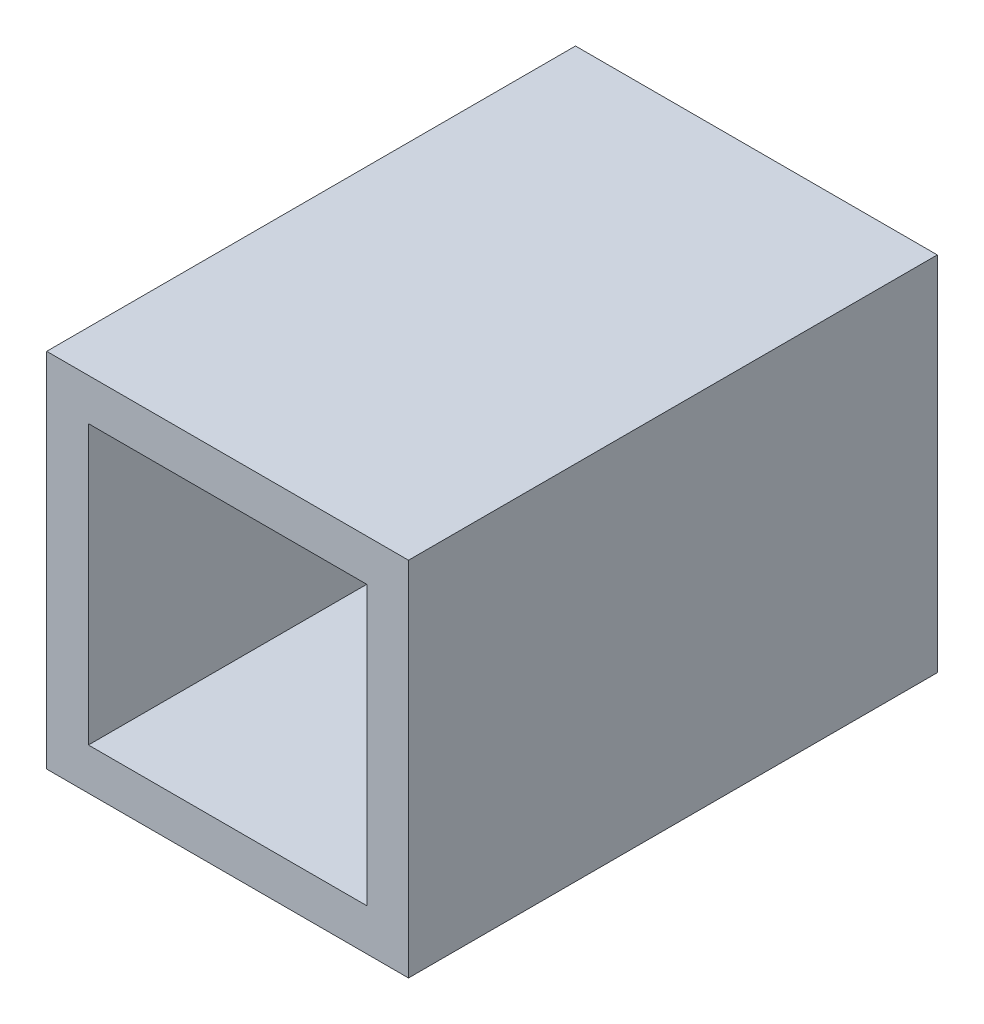
ISO-10303-21;
HEADER;
FILE_DESCRIPTION(('STEP AP214'),'2;1');
FILE_NAME('part.step','',(''),(''),'','','');
FILE_SCHEMA(('AUTOMOTIVE_DESIGN { 1 0 10303 214 1 1 1 1 }'));
ENDSEC;
DATA;
#1=APPLICATION_CONTEXT('core data for automotive mechanical design processes');
#2=APPLICATION_PROTOCOL_DEFINITION('international standard','automotive_design',2000,#1);
#3=PRODUCT_CONTEXT('',#1,'mechanical');
#4=PRODUCT('Part','Part','',(#3));
#5=PRODUCT_RELATED_PRODUCT_CATEGORY('part','',(#4));
#6=PRODUCT_DEFINITION_FORMATION('','',#4);
#7=PRODUCT_DEFINITION_CONTEXT('part definition',#1,'design');
#8=PRODUCT_DEFINITION('design','',#6,#7);
#9=PRODUCT_DEFINITION_SHAPE('','',#8);
#10=(LENGTH_UNIT() NAMED_UNIT(*) SI_UNIT(.MILLI.,.METRE.));
#11=(NAMED_UNIT(*) PLANE_ANGLE_UNIT() SI_UNIT($,.RADIAN.));
#12=(NAMED_UNIT(*) SI_UNIT($,.STERADIAN.) SOLID_ANGLE_UNIT());
#13=UNCERTAINTY_MEASURE_WITH_UNIT(LENGTH_MEASURE(1.E-05),#10,'distance_accuracy_value','');
#14=(GEOMETRIC_REPRESENTATION_CONTEXT(3) GLOBAL_UNCERTAINTY_ASSIGNED_CONTEXT((#13)) GLOBAL_UNIT_ASSIGNED_CONTEXT((#10,
#11,#12)) REPRESENTATION_CONTEXT('',''));
#15=CARTESIAN_POINT('',(0.,0.,0.));
#16=DIRECTION('',(0.,0.,1.));
#17=DIRECTION('',(1.,0.,0.));
#18=AXIS2_PLACEMENT_3D('',#15,#16,#17);
#19=CARTESIAN_POINT('',(0.,0.,19.));
#20=DIRECTION('',(0.,0.,1.));
#21=DIRECTION('',(1.,0.,0.));
#22=AXIS2_PLACEMENT_3D('',#19,#20,#21);
#23=PLANE('',#22);
#24=DIRECTION('',(0.,1.,0.));
#25=VECTOR('',#24,1.);
#26=CARTESIAN_POINT('',(6.5,6.5,19.));
#27=LINE('',#26,#25);
#28=CARTESIAN_POINT('',(6.5,-6.5,19.));
#29=VERTEX_POINT('',#28);
#30=CARTESIAN_POINT('',(6.5,6.5,19.));
#31=VERTEX_POINT('',#30);
#32=EDGE_CURVE('E136',#29,#31,#27,.T.);
#33=ORIENTED_EDGE('',*,*,#32,.T.);
#34=DIRECTION('',(-1.,0.,0.));
#35=VECTOR('',#34,1.);
#36=CARTESIAN_POINT('',(-6.5,6.5,19.));
#37=LINE('',#36,#35);
#38=CARTESIAN_POINT('',(-6.5,6.5,19.));
#39=VERTEX_POINT('',#38);
#40=EDGE_CURVE('E139',#31,#39,#37,.T.);
#41=ORIENTED_EDGE('',*,*,#40,.T.);
#42=DIRECTION('',(0.,-1.,0.));
#43=VECTOR('',#42,1.);
#44=CARTESIAN_POINT('',(-6.5,6.5,19.));
#45=LINE('',#44,#43);
#46=CARTESIAN_POINT('',(-6.5,-6.5,19.));
#47=VERTEX_POINT('',#46);
#48=EDGE_CURVE('E142',#39,#47,#45,.T.);
#49=ORIENTED_EDGE('',*,*,#48,.T.);
#50=DIRECTION('',(1.,0.,0.));
#51=VECTOR('',#50,1.);
#52=CARTESIAN_POINT('',(-6.5,-6.5,19.));
#53=LINE('',#52,#51);
#54=EDGE_CURVE('E144',#47,#29,#53,.T.);
#55=ORIENTED_EDGE('',*,*,#54,.T.);
#56=EDGE_LOOP('',(#33,#41,#49,#55));
#57=FACE_BOUND('',#56,.T.);
#58=DIRECTION('',(-1.,0.,0.));
#59=VECTOR('',#58,1.);
#60=CARTESIAN_POINT('',(-5.,5.00000000000001,19.));
#61=LINE('',#60,#59);
#62=CARTESIAN_POINT('',(5.,5.00000000000001,19.));
#63=VERTEX_POINT('',#62);
#64=CARTESIAN_POINT('',(-5.,5.00000000000001,19.));
#65=VERTEX_POINT('',#64);
#66=EDGE_CURVE('E108',#63,#65,#61,.T.);
#67=ORIENTED_EDGE('',*,*,#66,.F.);
#68=DIRECTION('',(0.,1.,0.));
#69=VECTOR('',#68,1.);
#70=CARTESIAN_POINT('',(5.,-5.,19.));
#71=LINE('',#70,#69);
#72=CARTESIAN_POINT('',(5.,-5.,19.));
#73=VERTEX_POINT('',#72);
#74=EDGE_CURVE('E100',#73,#63,#71,.T.);
#75=ORIENTED_EDGE('',*,*,#74,.F.);
#76=DIRECTION('',(1.,0.,0.));
#77=VECTOR('',#76,1.);
#78=CARTESIAN_POINT('',(-5.,-5.,19.));
#79=LINE('',#78,#77);
#80=CARTESIAN_POINT('',(-5.,-5.,19.));
#81=VERTEX_POINT('',#80);
#82=EDGE_CURVE('E122',#81,#73,#79,.T.);
#83=ORIENTED_EDGE('',*,*,#82,.F.);
#84=DIRECTION('',(0.,-1.,0.));
#85=VECTOR('',#84,1.);
#86=CARTESIAN_POINT('',(-5.,-5.,19.));
#87=LINE('',#86,#85);
#88=EDGE_CURVE('E120',#65,#81,#87,.T.);
#89=ORIENTED_EDGE('',*,*,#88,.F.);
#90=EDGE_LOOP('',(#67,#75,#83,#89));
#91=FACE_BOUND('',#90,.T.);
#92=ADVANCED_FACE('F35',(#57,#91),#23,.T.);
#93=CARTESIAN_POINT('',(0.,0.,0.));
#94=DIRECTION('',(0.,0.,1.));
#95=DIRECTION('',(1.,0.,0.));
#96=AXIS2_PLACEMENT_3D('',#93,#94,#95);
#97=PLANE('',#96);
#98=DIRECTION('',(0.,1.,0.));
#99=VECTOR('',#98,1.);
#100=CARTESIAN_POINT('',(6.5,6.5,0.));
#101=LINE('',#100,#99);
#102=CARTESIAN_POINT('',(6.5,-6.5,0.));
#103=VERTEX_POINT('',#102);
#104=CARTESIAN_POINT('',(6.5,6.5,0.));
#105=VERTEX_POINT('',#104);
#106=EDGE_CURVE('E116',#103,#105,#101,.T.);
#107=ORIENTED_EDGE('',*,*,#106,.F.);
#108=DIRECTION('',(1.,0.,0.));
#109=VECTOR('',#108,1.);
#110=CARTESIAN_POINT('',(-6.5,-6.5,0.));
#111=LINE('',#110,#109);
#112=CARTESIAN_POINT('',(-6.5,-6.5,0.));
#113=VERTEX_POINT('',#112);
#114=EDGE_CURVE('E140',#113,#103,#111,.T.);
#115=ORIENTED_EDGE('',*,*,#114,.F.);
#116=DIRECTION('',(0.,-1.,0.));
#117=VECTOR('',#116,1.);
#118=CARTESIAN_POINT('',(-6.5,6.5,0.));
#119=LINE('',#118,#117);
#120=CARTESIAN_POINT('',(-6.5,6.5,0.));
#121=VERTEX_POINT('',#120);
#122=EDGE_CURVE('E151',#121,#113,#119,.T.);
#123=ORIENTED_EDGE('',*,*,#122,.F.);
#124=DIRECTION('',(-1.,0.,0.));
#125=VECTOR('',#124,1.);
#126=CARTESIAN_POINT('',(-6.5,6.5,0.));
#127=LINE('',#126,#125);
#128=EDGE_CURVE('E149',#105,#121,#127,.T.);
#129=ORIENTED_EDGE('',*,*,#128,.F.);
#130=EDGE_LOOP('',(#107,#115,#123,#129));
#131=FACE_BOUND('',#130,.T.);
#132=DIRECTION('',(0.,1.,0.));
#133=VECTOR('',#132,1.);
#134=CARTESIAN_POINT('',(5.,-5.,0.));
#135=LINE('',#134,#133);
#136=CARTESIAN_POINT('',(5.,-5.,0.));
#137=VERTEX_POINT('',#136);
#138=CARTESIAN_POINT('',(5.,5.00000000000001,0.));
#139=VERTEX_POINT('',#138);
#140=EDGE_CURVE('E58',#137,#139,#135,.T.);
#141=ORIENTED_EDGE('',*,*,#140,.T.);
#142=DIRECTION('',(-1.,0.,0.));
#143=VECTOR('',#142,1.);
#144=CARTESIAN_POINT('',(-5.,5.00000000000001,0.));
#145=LINE('',#144,#143);
#146=CARTESIAN_POINT('',(-5.,5.00000000000001,0.));
#147=VERTEX_POINT('',#146);
#148=EDGE_CURVE('E115',#139,#147,#145,.T.);
#149=ORIENTED_EDGE('',*,*,#148,.T.);
#150=DIRECTION('',(0.,-1.,0.));
#151=VECTOR('',#150,1.);
#152=CARTESIAN_POINT('',(-5.,-5.,0.));
#153=LINE('',#152,#151);
#154=CARTESIAN_POINT('',(-5.,-5.,0.));
#155=VERTEX_POINT('',#154);
#156=EDGE_CURVE('E128',#147,#155,#153,.T.);
#157=ORIENTED_EDGE('',*,*,#156,.T.);
#158=DIRECTION('',(1.,0.,0.));
#159=VECTOR('',#158,1.);
#160=CARTESIAN_POINT('',(-5.,-5.,0.));
#161=LINE('',#160,#159);
#162=EDGE_CURVE('E109',#155,#137,#161,.T.);
#163=ORIENTED_EDGE('',*,*,#162,.T.);
#164=EDGE_LOOP('',(#141,#149,#157,#163));
#165=FACE_BOUND('',#164,.T.);
#166=ADVANCED_FACE('F169',(#131,#165),#97,.F.);
#167=CARTESIAN_POINT('',(6.5,6.5,19.));
#168=DIRECTION('',(-1.,0.,0.));
#169=DIRECTION('',(0.,0.,1.));
#170=AXIS2_PLACEMENT_3D('',#167,#168,#169);
#171=PLANE('',#170);
#172=ORIENTED_EDGE('',*,*,#106,.T.);
#173=DIRECTION('',(0.,0.,-1.));
#174=VECTOR('',#173,1.);
#175=CARTESIAN_POINT('',(6.5,6.5,19.));
#176=LINE('',#175,#174);
#177=EDGE_CURVE('E11',#31,#105,#176,.T.);
#178=ORIENTED_EDGE('',*,*,#177,.F.);
#179=ORIENTED_EDGE('',*,*,#32,.F.);
#180=DIRECTION('',(0.,0.,-1.));
#181=VECTOR('',#180,1.);
#182=CARTESIAN_POINT('',(6.5,-6.5,19.));
#183=LINE('',#182,#181);
#184=EDGE_CURVE('E146',#29,#103,#183,.T.);
#185=ORIENTED_EDGE('',*,*,#184,.T.);
#186=EDGE_LOOP('',(#172,#178,#179,#185));
#187=FACE_BOUND('',#186,.T.);
#188=ADVANCED_FACE('F37',(#187),#171,.F.);
#189=CARTESIAN_POINT('',(-6.5,6.5,19.));
#190=DIRECTION('',(0.,-1.,0.));
#191=DIRECTION('',(0.,0.,-1.));
#192=AXIS2_PLACEMENT_3D('',#189,#190,#191);
#193=PLANE('',#192);
#194=ORIENTED_EDGE('',*,*,#128,.T.);
#195=DIRECTION('',(0.,0.,-1.));
#196=VECTOR('',#195,1.);
#197=CARTESIAN_POINT('',(-6.5,6.5,19.));
#198=LINE('',#197,#196);
#199=EDGE_CURVE('E43',#39,#121,#198,.T.);
#200=ORIENTED_EDGE('',*,*,#199,.F.);
#201=ORIENTED_EDGE('',*,*,#40,.F.);
#202=ORIENTED_EDGE('',*,*,#177,.T.);
#203=EDGE_LOOP('',(#194,#200,#201,#202));
#204=FACE_BOUND('',#203,.T.);
#205=ADVANCED_FACE('F179',(#204),#193,.F.);
#206=CARTESIAN_POINT('',(-6.5,6.5,19.));
#207=DIRECTION('',(1.,0.,0.));
#208=DIRECTION('',(0.,0.,-1.));
#209=AXIS2_PLACEMENT_3D('',#206,#207,#208);
#210=PLANE('',#209);
#211=ORIENTED_EDGE('',*,*,#122,.T.);
#212=DIRECTION('',(0.,0.,-1.));
#213=VECTOR('',#212,1.);
#214=CARTESIAN_POINT('',(-6.5,-6.5,19.));
#215=LINE('',#214,#213);
#216=EDGE_CURVE('E156',#47,#113,#215,.T.);
#217=ORIENTED_EDGE('',*,*,#216,.F.);
#218=ORIENTED_EDGE('',*,*,#48,.F.);
#219=ORIENTED_EDGE('',*,*,#199,.T.);
#220=EDGE_LOOP('',(#211,#217,#218,#219));
#221=FACE_BOUND('',#220,.T.);
#222=ADVANCED_FACE('F163',(#221),#210,.F.);
#223=CARTESIAN_POINT('',(-6.5,-6.5,19.));
#224=DIRECTION('',(0.,1.,0.));
#225=DIRECTION('',(0.,0.,1.));
#226=AXIS2_PLACEMENT_3D('',#223,#224,#225);
#227=PLANE('',#226);
#228=ORIENTED_EDGE('',*,*,#114,.T.);
#229=ORIENTED_EDGE('',*,*,#184,.F.);
#230=ORIENTED_EDGE('',*,*,#54,.F.);
#231=ORIENTED_EDGE('',*,*,#216,.T.);
#232=EDGE_LOOP('',(#228,#229,#230,#231));
#233=FACE_BOUND('',#232,.T.);
#234=ADVANCED_FACE('F173',(#233),#227,.F.);
#235=CARTESIAN_POINT('',(5.,-5.,19.));
#236=DIRECTION('',(-1.,0.,0.));
#237=DIRECTION('',(0.,0.,1.));
#238=AXIS2_PLACEMENT_3D('',#235,#236,#237);
#239=PLANE('',#238);
#240=ORIENTED_EDGE('',*,*,#140,.F.);
#241=DIRECTION('',(0.,0.,-1.));
#242=VECTOR('',#241,1.);
#243=CARTESIAN_POINT('',(5.,-5.,19.));
#244=LINE('',#243,#242);
#245=EDGE_CURVE('E104',#73,#137,#244,.T.);
#246=ORIENTED_EDGE('',*,*,#245,.F.);
#247=ORIENTED_EDGE('',*,*,#74,.T.);
#248=DIRECTION('',(0.,0.,-1.));
#249=VECTOR('',#248,1.);
#250=CARTESIAN_POINT('',(5.,5.00000000000001,19.));
#251=LINE('',#250,#249);
#252=EDGE_CURVE('E103',#63,#139,#251,.T.);
#253=ORIENTED_EDGE('',*,*,#252,.T.);
#254=EDGE_LOOP('',(#240,#246,#247,#253));
#255=FACE_BOUND('',#254,.T.);
#256=ADVANCED_FACE('F102',(#255),#239,.T.);
#257=CARTESIAN_POINT('',(-5.,5.00000000000001,19.));
#258=DIRECTION('',(0.,-1.,0.));
#259=DIRECTION('',(0.,0.,-1.));
#260=AXIS2_PLACEMENT_3D('',#257,#258,#259);
#261=PLANE('',#260);
#262=ORIENTED_EDGE('',*,*,#148,.F.);
#263=ORIENTED_EDGE('',*,*,#252,.F.);
#264=ORIENTED_EDGE('',*,*,#66,.T.);
#265=DIRECTION('',(0.,0.,-1.));
#266=VECTOR('',#265,1.);
#267=CARTESIAN_POINT('',(-5.,5.00000000000001,19.));
#268=LINE('',#267,#266);
#269=EDGE_CURVE('E117',#65,#147,#268,.T.);
#270=ORIENTED_EDGE('',*,*,#269,.T.);
#271=EDGE_LOOP('',(#262,#263,#264,#270));
#272=FACE_BOUND('',#271,.T.);
#273=ADVANCED_FACE('F112',(#272),#261,.T.);
#274=CARTESIAN_POINT('',(-5.,-5.,19.));
#275=DIRECTION('',(1.,0.,0.));
#276=DIRECTION('',(0.,0.,-1.));
#277=AXIS2_PLACEMENT_3D('',#274,#275,#276);
#278=PLANE('',#277);
#279=ORIENTED_EDGE('',*,*,#156,.F.);
#280=ORIENTED_EDGE('',*,*,#269,.F.);
#281=ORIENTED_EDGE('',*,*,#88,.T.);
#282=DIRECTION('',(0.,0.,-1.));
#283=VECTOR('',#282,1.);
#284=CARTESIAN_POINT('',(-5.,-5.,19.));
#285=LINE('',#284,#283);
#286=EDGE_CURVE('E50',#81,#155,#285,.T.);
#287=ORIENTED_EDGE('',*,*,#286,.T.);
#288=EDGE_LOOP('',(#279,#280,#281,#287));
#289=FACE_BOUND('',#288,.T.);
#290=ADVANCED_FACE('F202',(#289),#278,.T.);
#291=CARTESIAN_POINT('',(-5.,-5.,19.));
#292=DIRECTION('',(0.,1.,0.));
#293=DIRECTION('',(0.,0.,1.));
#294=AXIS2_PLACEMENT_3D('',#291,#292,#293);
#295=PLANE('',#294);
#296=ORIENTED_EDGE('',*,*,#162,.F.);
#297=ORIENTED_EDGE('',*,*,#286,.F.);
#298=ORIENTED_EDGE('',*,*,#82,.T.);
#299=ORIENTED_EDGE('',*,*,#245,.T.);
#300=EDGE_LOOP('',(#296,#297,#298,#299));
#301=FACE_BOUND('',#300,.T.);
#302=ADVANCED_FACE('F206',(#301),#295,.T.);
#303=CLOSED_SHELL('',(#92,#166,#188,#205,#222,#234,#256,#273,#290,#302));
#304=MANIFOLD_SOLID_BREP('B2',#303);
#305=ADVANCED_BREP_SHAPE_REPRESENTATION('',(#18,#304),#14);
#306=SHAPE_DEFINITION_REPRESENTATION(#9,#305);
ENDSEC;
END-ISO-10303-21;
